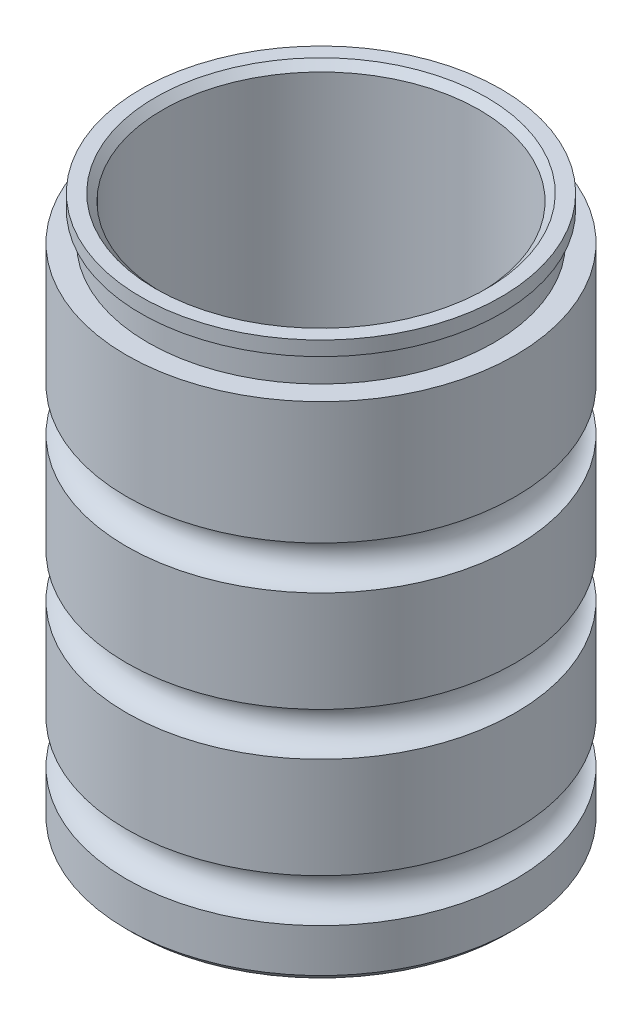
ISO-10303-21;
HEADER;
FILE_DESCRIPTION(('STEP AP214'),'2;1');
FILE_NAME('part.step','',(''),(''),'','','');
FILE_SCHEMA(('AUTOMOTIVE_DESIGN { 1 0 10303 214 1 1 1 1 }'));
ENDSEC;
DATA;
#1=APPLICATION_CONTEXT('core data for automotive mechanical design processes');
#2=APPLICATION_PROTOCOL_DEFINITION('international standard','automotive_design',2000,#1);
#3=PRODUCT_CONTEXT('',#1,'mechanical');
#4=PRODUCT('Part','Part','',(#3));
#5=PRODUCT_RELATED_PRODUCT_CATEGORY('part','',(#4));
#6=PRODUCT_DEFINITION_FORMATION('','',#4);
#7=PRODUCT_DEFINITION_CONTEXT('part definition',#1,'design');
#8=PRODUCT_DEFINITION('design','',#6,#7);
#9=PRODUCT_DEFINITION_SHAPE('','',#8);
#10=(LENGTH_UNIT() NAMED_UNIT(*) SI_UNIT(.MILLI.,.METRE.));
#11=(NAMED_UNIT(*) PLANE_ANGLE_UNIT() SI_UNIT($,.RADIAN.));
#12=(NAMED_UNIT(*) SI_UNIT($,.STERADIAN.) SOLID_ANGLE_UNIT());
#13=UNCERTAINTY_MEASURE_WITH_UNIT(LENGTH_MEASURE(1.E-05),#10,'distance_accuracy_value','');
#14=(GEOMETRIC_REPRESENTATION_CONTEXT(3) GLOBAL_UNCERTAINTY_ASSIGNED_CONTEXT((#13)) GLOBAL_UNIT_ASSIGNED_CONTEXT((#10,
#11,#12)) REPRESENTATION_CONTEXT('',''));
#15=CARTESIAN_POINT('',(0.,0.,0.));
#16=DIRECTION('',(0.,0.,1.));
#17=DIRECTION('',(1.,0.,0.));
#18=AXIS2_PLACEMENT_3D('',#15,#16,#17);
#19=CARTESIAN_POINT('',(0.,-29.1154086371947,0.));
#20=DIRECTION('',(0.,-1.,0.));
#21=DIRECTION('',(0.,0.,-1.));
#22=AXIS2_PLACEMENT_3D('',#19,#20,#21);
#23=CYLINDRICAL_SURFACE('',#22,11.);
#24=CARTESIAN_POINT('',(0.,37.5,0.));
#25=DIRECTION('',(0.,-1.,0.));
#26=DIRECTION('',(0.,0.,-1.));
#27=AXIS2_PLACEMENT_3D('',#24,#25,#26);
#28=CIRCLE('',#27,11.);
#29=CARTESIAN_POINT('',(0.,37.5,-11.));
#30=VERTEX_POINT('',#29);
#31=EDGE_CURVE('E49',#30,#30,#28,.F.);
#32=ORIENTED_EDGE('',*,*,#31,.T.);
#33=EDGE_LOOP('',(#32));
#34=FACE_BOUND('',#33,.T.);
#35=CARTESIAN_POINT('',(0.,12.,0.));
#36=DIRECTION('',(0.,-1.,0.));
#37=DIRECTION('',(0.,0.,-1.));
#38=AXIS2_PLACEMENT_3D('',#35,#36,#37);
#39=CIRCLE('',#38,11.);
#40=CARTESIAN_POINT('',(0.,12.,-11.));
#41=VERTEX_POINT('',#40);
#42=EDGE_CURVE('E82',#41,#41,#39,.T.);
#43=ORIENTED_EDGE('',*,*,#42,.T.);
#44=EDGE_LOOP('',(#43));
#45=FACE_BOUND('',#44,.T.);
#46=ADVANCED_FACE('F37',(#34,#45),#23,.F.);
#47=CARTESIAN_POINT('',(-11.,12.,0.));
#48=DIRECTION('',(0.,-1.,0.));
#49=DIRECTION('',(0.,0.,-1.));
#50=AXIS2_PLACEMENT_3D('',#47,#48,#49);
#51=PLANE('',#50);
#52=CARTESIAN_POINT('',(0.,12.,0.));
#53=DIRECTION('',(0.,-1.,0.));
#54=DIRECTION('',(0.,0.,-1.));
#55=AXIS2_PLACEMENT_3D('',#52,#53,#54);
#56=CIRCLE('',#55,2.5);
#57=CARTESIAN_POINT('',(0.,12.,-2.5));
#58=VERTEX_POINT('',#57);
#59=EDGE_CURVE('E79',#58,#58,#56,.T.);
#60=ORIENTED_EDGE('',*,*,#59,.T.);
#61=EDGE_LOOP('',(#60));
#62=FACE_BOUND('',#61,.T.);
#63=ORIENTED_EDGE('',*,*,#42,.F.);
#64=EDGE_LOOP('',(#63));
#65=FACE_BOUND('',#64,.T.);
#66=ADVANCED_FACE('F143',(#62,#65),#51,.F.);
#67=CARTESIAN_POINT('',(0.,0.,0.));
#68=DIRECTION('',(0.,1.,0.));
#69=DIRECTION('',(0.,0.,1.));
#70=AXIS2_PLACEMENT_3D('',#67,#68,#69);
#71=PLANE('',#70);
#72=CARTESIAN_POINT('',(0.,0.,0.));
#73=DIRECTION('',(0.,1.,0.));
#74=DIRECTION('',(0.,0.,1.));
#75=AXIS2_PLACEMENT_3D('',#72,#73,#74);
#76=CIRCLE('',#75,13.);
#77=CARTESIAN_POINT('',(0.,0.,13.));
#78=VERTEX_POINT('',#77);
#79=EDGE_CURVE('E45',#78,#78,#76,.F.);
#80=ORIENTED_EDGE('',*,*,#79,.T.);
#81=EDGE_LOOP('',(#80));
#82=FACE_BOUND('',#81,.T.);
#83=CARTESIAN_POINT('',(-8.,0.,0.));
#84=DIRECTION('',(0.,1.,0.));
#85=DIRECTION('',(0.,0.,1.));
#86=AXIS2_PLACEMENT_3D('',#83,#84,#85);
#87=CIRCLE('',#86,3.00000000000001);
#88=CARTESIAN_POINT('',(-8.,0.,3.00000000000001));
#89=VERTEX_POINT('',#88);
#90=EDGE_CURVE('E61',#89,#89,#87,.T.);
#91=ORIENTED_EDGE('',*,*,#90,.T.);
#92=EDGE_LOOP('',(#91));
#93=FACE_BOUND('',#92,.T.);
#94=CARTESIAN_POINT('',(8.,0.,0.));
#95=DIRECTION('',(0.,1.,0.));
#96=DIRECTION('',(0.,0.,1.));
#97=AXIS2_PLACEMENT_3D('',#94,#95,#96);
#98=CIRCLE('',#97,3.00000000000001);
#99=CARTESIAN_POINT('',(8.,0.,3.00000000000001));
#100=VERTEX_POINT('',#99);
#101=EDGE_CURVE('E64',#100,#100,#98,.T.);
#102=ORIENTED_EDGE('',*,*,#101,.T.);
#103=EDGE_LOOP('',(#102));
#104=FACE_BOUND('',#103,.T.);
#105=CARTESIAN_POINT('',(0.,0.,0.));
#106=DIRECTION('',(0.,1.,0.));
#107=DIRECTION('',(0.,0.,1.));
#108=AXIS2_PLACEMENT_3D('',#105,#106,#107);
#109=CIRCLE('',#108,2.50000000000001);
#110=CARTESIAN_POINT('',(0.,0.,2.50000000000001));
#111=VERTEX_POINT('',#110);
#112=EDGE_CURVE('E70',#111,#111,#109,.T.);
#113=ORIENTED_EDGE('',*,*,#112,.T.);
#114=EDGE_LOOP('',(#113));
#115=FACE_BOUND('',#114,.T.);
#116=ADVANCED_FACE('F149',(#82,#93,#104,#115),#71,.F.);
#117=CARTESIAN_POINT('',(0.,-29.1154086371947,0.));
#118=DIRECTION('',(0.,-1.,0.));
#119=DIRECTION('',(0.,0.,-1.));
#120=AXIS2_PLACEMENT_3D('',#117,#118,#119);
#121=CYLINDRICAL_SURFACE('',#120,13.5);
#122=CARTESIAN_POINT('',(0.,0.500000000000004,0.));
#123=DIRECTION('',(0.,1.,0.));
#124=DIRECTION('',(0.,0.,1.));
#125=AXIS2_PLACEMENT_3D('',#122,#123,#124);
#126=CIRCLE('',#125,13.5);
#127=CARTESIAN_POINT('',(0.,0.500000000000004,13.5));
#128=VERTEX_POINT('',#127);
#129=EDGE_CURVE('E10',#128,#128,#126,.T.);
#130=ORIENTED_EDGE('',*,*,#129,.T.);
#131=EDGE_LOOP('',(#130));
#132=FACE_BOUND('',#131,.T.);
#133=CARTESIAN_POINT('',(0.,3.5,0.));
#134=DIRECTION('',(0.,-1.,0.));
#135=DIRECTION('',(0.,0.,-1.));
#136=AXIS2_PLACEMENT_3D('',#133,#134,#135);
#137=CIRCLE('',#136,13.5);
#138=CARTESIAN_POINT('',(0.,3.5,-13.5));
#139=VERTEX_POINT('',#138);
#140=EDGE_CURVE('E85',#139,#139,#137,.T.);
#141=ORIENTED_EDGE('',*,*,#140,.T.);
#142=EDGE_LOOP('',(#141));
#143=FACE_BOUND('',#142,.T.);
#144=ADVANCED_FACE('F245',(#132,#143),#121,.T.);
#145=CARTESIAN_POINT('',(0.,5.,0.));
#146=DIRECTION('',(0.,-1.,0.));
#147=DIRECTION('',(0.,0.,-1.));
#148=AXIS2_PLACEMENT_3D('',#145,#146,#147);
#149=TOROIDAL_SURFACE('',#148,13.5,1.5);
#150=ORIENTED_EDGE('',*,*,#140,.F.);
#151=EDGE_LOOP('',(#150));
#152=FACE_BOUND('',#151,.T.);
#153=CARTESIAN_POINT('',(0.,6.5,0.));
#154=DIRECTION('',(0.,-1.,0.));
#155=DIRECTION('',(0.,0.,-1.));
#156=AXIS2_PLACEMENT_3D('',#153,#154,#155);
#157=CIRCLE('',#156,13.5);
#158=CARTESIAN_POINT('',(0.,6.5,-13.5));
#159=VERTEX_POINT('',#158);
#160=EDGE_CURVE('E88',#159,#159,#157,.T.);
#161=ORIENTED_EDGE('',*,*,#160,.T.);
#162=EDGE_LOOP('',(#161));
#163=FACE_BOUND('',#162,.T.);
#164=ADVANCED_FACE('F241',(#152,#163),#149,.F.);
#165=CARTESIAN_POINT('',(0.,-29.1154086371947,0.));
#166=DIRECTION('',(0.,-1.,0.));
#167=DIRECTION('',(0.,0.,-1.));
#168=AXIS2_PLACEMENT_3D('',#165,#166,#167);
#169=CYLINDRICAL_SURFACE('',#168,13.5);
#170=ORIENTED_EDGE('',*,*,#160,.F.);
#171=EDGE_LOOP('',(#170));
#172=FACE_BOUND('',#171,.T.);
#173=CARTESIAN_POINT('',(0.,13.5,0.));
#174=DIRECTION('',(0.,-1.,0.));
#175=DIRECTION('',(0.,0.,-1.));
#176=AXIS2_PLACEMENT_3D('',#173,#174,#175);
#177=CIRCLE('',#176,13.5);
#178=CARTESIAN_POINT('',(0.,13.5,-13.5));
#179=VERTEX_POINT('',#178);
#180=EDGE_CURVE('E91',#179,#179,#177,.T.);
#181=ORIENTED_EDGE('',*,*,#180,.T.);
#182=EDGE_LOOP('',(#181));
#183=FACE_BOUND('',#182,.T.);
#184=ADVANCED_FACE('F237',(#172,#183),#169,.T.);
#185=CARTESIAN_POINT('',(0.,15.,0.));
#186=DIRECTION('',(0.,-1.,0.));
#187=DIRECTION('',(0.,0.,-1.));
#188=AXIS2_PLACEMENT_3D('',#185,#186,#187);
#189=TOROIDAL_SURFACE('',#188,13.5,1.5);
#190=ORIENTED_EDGE('',*,*,#180,.F.);
#191=EDGE_LOOP('',(#190));
#192=FACE_BOUND('',#191,.T.);
#193=CARTESIAN_POINT('',(0.,16.5,0.));
#194=DIRECTION('',(0.,-1.,0.));
#195=DIRECTION('',(0.,0.,-1.));
#196=AXIS2_PLACEMENT_3D('',#193,#194,#195);
#197=CIRCLE('',#196,13.5);
#198=CARTESIAN_POINT('',(0.,16.5,-13.5));
#199=VERTEX_POINT('',#198);
#200=EDGE_CURVE('E94',#199,#199,#197,.T.);
#201=ORIENTED_EDGE('',*,*,#200,.T.);
#202=EDGE_LOOP('',(#201));
#203=FACE_BOUND('',#202,.T.);
#204=ADVANCED_FACE('F233',(#192,#203),#189,.F.);
#205=CARTESIAN_POINT('',(0.,-29.1154086371947,0.));
#206=DIRECTION('',(0.,-1.,0.));
#207=DIRECTION('',(0.,0.,-1.));
#208=AXIS2_PLACEMENT_3D('',#205,#206,#207);
#209=CYLINDRICAL_SURFACE('',#208,13.5);
#210=ORIENTED_EDGE('',*,*,#200,.F.);
#211=EDGE_LOOP('',(#210));
#212=FACE_BOUND('',#211,.T.);
#213=CARTESIAN_POINT('',(0.,23.5,0.));
#214=DIRECTION('',(0.,-1.,0.));
#215=DIRECTION('',(0.,0.,-1.));
#216=AXIS2_PLACEMENT_3D('',#213,#214,#215);
#217=CIRCLE('',#216,13.5);
#218=CARTESIAN_POINT('',(0.,23.5,-13.5));
#219=VERTEX_POINT('',#218);
#220=EDGE_CURVE('E97',#219,#219,#217,.T.);
#221=ORIENTED_EDGE('',*,*,#220,.T.);
#222=EDGE_LOOP('',(#221));
#223=FACE_BOUND('',#222,.T.);
#224=ADVANCED_FACE('F229',(#212,#223),#209,.T.);
#225=CARTESIAN_POINT('',(0.,25.,0.));
#226=DIRECTION('',(0.,-1.,0.));
#227=DIRECTION('',(0.,0.,-1.));
#228=AXIS2_PLACEMENT_3D('',#225,#226,#227);
#229=TOROIDAL_SURFACE('',#228,13.5,1.5);
#230=ORIENTED_EDGE('',*,*,#220,.F.);
#231=EDGE_LOOP('',(#230));
#232=FACE_BOUND('',#231,.T.);
#233=CARTESIAN_POINT('',(0.,26.5,0.));
#234=DIRECTION('',(0.,-1.,0.));
#235=DIRECTION('',(0.,0.,-1.));
#236=AXIS2_PLACEMENT_3D('',#233,#234,#235);
#237=CIRCLE('',#236,13.5);
#238=CARTESIAN_POINT('',(0.,26.5,-13.5));
#239=VERTEX_POINT('',#238);
#240=EDGE_CURVE('E100',#239,#239,#237,.T.);
#241=ORIENTED_EDGE('',*,*,#240,.T.);
#242=EDGE_LOOP('',(#241));
#243=FACE_BOUND('',#242,.T.);
#244=ADVANCED_FACE('F225',(#232,#243),#229,.F.);
#245=CARTESIAN_POINT('',(0.,-29.1154086371947,0.));
#246=DIRECTION('',(0.,-1.,0.));
#247=DIRECTION('',(0.,0.,-1.));
#248=AXIS2_PLACEMENT_3D('',#245,#246,#247);
#249=CYLINDRICAL_SURFACE('',#248,13.5);
#250=ORIENTED_EDGE('',*,*,#240,.F.);
#251=EDGE_LOOP('',(#250));
#252=FACE_BOUND('',#251,.T.);
#253=CARTESIAN_POINT('',(0.,35.,0.));
#254=DIRECTION('',(0.,-1.,0.));
#255=DIRECTION('',(0.,0.,-1.));
#256=AXIS2_PLACEMENT_3D('',#253,#254,#255);
#257=CIRCLE('',#256,13.5);
#258=CARTESIAN_POINT('',(0.,35.,-13.5));
#259=VERTEX_POINT('',#258);
#260=EDGE_CURVE('E103',#259,#259,#257,.T.);
#261=ORIENTED_EDGE('',*,*,#260,.T.);
#262=EDGE_LOOP('',(#261));
#263=FACE_BOUND('',#262,.T.);
#264=ADVANCED_FACE('F221',(#252,#263),#249,.T.);
#265=CARTESIAN_POINT('',(-12.,35.,0.));
#266=DIRECTION('',(0.,-1.,0.));
#267=DIRECTION('',(0.,0.,-1.));
#268=AXIS2_PLACEMENT_3D('',#265,#266,#267);
#269=PLANE('',#268);
#270=ORIENTED_EDGE('',*,*,#260,.F.);
#271=EDGE_LOOP('',(#270));
#272=FACE_BOUND('',#271,.T.);
#273=CARTESIAN_POINT('',(0.,35.,0.));
#274=DIRECTION('',(0.,-1.,0.));
#275=DIRECTION('',(0.,0.,-1.));
#276=AXIS2_PLACEMENT_3D('',#273,#274,#275);
#277=CIRCLE('',#276,12.);
#278=CARTESIAN_POINT('',(0.,35.,-12.));
#279=VERTEX_POINT('',#278);
#280=EDGE_CURVE('E106',#279,#279,#277,.T.);
#281=ORIENTED_EDGE('',*,*,#280,.T.);
#282=EDGE_LOOP('',(#281));
#283=FACE_BOUND('',#282,.T.);
#284=ADVANCED_FACE('F217',(#272,#283),#269,.F.);
#285=CARTESIAN_POINT('',(0.,-29.1154086371947,0.));
#286=DIRECTION('',(0.,-1.,0.));
#287=DIRECTION('',(0.,0.,-1.));
#288=AXIS2_PLACEMENT_3D('',#285,#286,#287);
#289=CYLINDRICAL_SURFACE('',#288,12.);
#290=ORIENTED_EDGE('',*,*,#280,.F.);
#291=EDGE_LOOP('',(#290));
#292=FACE_BOUND('',#291,.T.);
#293=CARTESIAN_POINT('',(0.,37.,0.));
#294=DIRECTION('',(0.,-1.,0.));
#295=DIRECTION('',(0.,0.,-1.));
#296=AXIS2_PLACEMENT_3D('',#293,#294,#295);
#297=CIRCLE('',#296,12.);
#298=CARTESIAN_POINT('',(0.,37.,-12.));
#299=VERTEX_POINT('',#298);
#300=EDGE_CURVE('E109',#299,#299,#297,.T.);
#301=ORIENTED_EDGE('',*,*,#300,.T.);
#302=EDGE_LOOP('',(#301));
#303=FACE_BOUND('',#302,.T.);
#304=ADVANCED_FACE('F210',(#292,#303),#289,.T.);
#305=CARTESIAN_POINT('',(-12.5,37.,0.));
#306=DIRECTION('',(0.,1.,0.));
#307=DIRECTION('',(0.,0.,1.));
#308=AXIS2_PLACEMENT_3D('',#305,#306,#307);
#309=PLANE('',#308);
#310=ORIENTED_EDGE('',*,*,#300,.F.);
#311=EDGE_LOOP('',(#310));
#312=FACE_BOUND('',#311,.T.);
#313=CARTESIAN_POINT('',(0.,37.,0.));
#314=DIRECTION('',(0.,-1.,0.));
#315=DIRECTION('',(0.,0.,-1.));
#316=AXIS2_PLACEMENT_3D('',#313,#314,#315);
#317=CIRCLE('',#316,12.5);
#318=CARTESIAN_POINT('',(0.,37.,-12.5));
#319=VERTEX_POINT('',#318);
#320=EDGE_CURVE('E112',#319,#319,#317,.T.);
#321=ORIENTED_EDGE('',*,*,#320,.T.);
#322=EDGE_LOOP('',(#321));
#323=FACE_BOUND('',#322,.T.);
#324=ADVANCED_FACE('F204',(#312,#323),#309,.F.);
#325=CARTESIAN_POINT('',(0.,-29.1154086371947,0.));
#326=DIRECTION('',(0.,-1.,0.));
#327=DIRECTION('',(0.,0.,-1.));
#328=AXIS2_PLACEMENT_3D('',#325,#326,#327);
#329=CYLINDRICAL_SURFACE('',#328,12.5);
#330=ORIENTED_EDGE('',*,*,#320,.F.);
#331=EDGE_LOOP('',(#330));
#332=FACE_BOUND('',#331,.T.);
#333=CARTESIAN_POINT('',(0.,38.,0.));
#334=DIRECTION('',(0.,-1.,0.));
#335=DIRECTION('',(0.,0.,-1.));
#336=AXIS2_PLACEMENT_3D('',#333,#334,#335);
#337=CIRCLE('',#336,12.5);
#338=CARTESIAN_POINT('',(0.,38.,-12.5));
#339=VERTEX_POINT('',#338);
#340=EDGE_CURVE('E115',#339,#339,#337,.T.);
#341=ORIENTED_EDGE('',*,*,#340,.T.);
#342=EDGE_LOOP('',(#341));
#343=FACE_BOUND('',#342,.T.);
#344=ADVANCED_FACE('F199',(#332,#343),#329,.T.);
#345=CARTESIAN_POINT('',(-12.5,38.,0.));
#346=DIRECTION('',(0.,-1.,0.));
#347=DIRECTION('',(0.,0.,-1.));
#348=AXIS2_PLACEMENT_3D('',#345,#346,#347);
#349=PLANE('',#348);
#350=CARTESIAN_POINT('',(0.,38.,0.));
#351=DIRECTION('',(0.,-1.,0.));
#352=DIRECTION('',(0.,0.,-1.));
#353=AXIS2_PLACEMENT_3D('',#350,#351,#352);
#354=CIRCLE('',#353,11.5);
#355=CARTESIAN_POINT('',(0.,38.,-11.5));
#356=VERTEX_POINT('',#355);
#357=EDGE_CURVE('E53',#356,#356,#354,.T.);
#358=ORIENTED_EDGE('',*,*,#357,.T.);
#359=EDGE_LOOP('',(#358));
#360=FACE_BOUND('',#359,.T.);
#361=ORIENTED_EDGE('',*,*,#340,.F.);
#362=EDGE_LOOP('',(#361));
#363=FACE_BOUND('',#362,.T.);
#364=ADVANCED_FACE('F196',(#360,#363),#349,.F.);
#365=CARTESIAN_POINT('',(-8.,10.,0.));
#366=DIRECTION('',(0.,-1.,0.));
#367=DIRECTION('',(0.,0.,-1.));
#368=AXIS2_PLACEMENT_3D('',#365,#366,#367);
#369=CYLINDRICAL_SURFACE('',#368,2.5);
#370=CARTESIAN_POINT('',(-8.,0.500000000000011,0.));
#371=DIRECTION('',(0.,1.,0.));
#372=DIRECTION('',(0.,0.,1.));
#373=AXIS2_PLACEMENT_3D('',#370,#371,#372);
#374=CIRCLE('',#373,2.5);
#375=CARTESIAN_POINT('',(-8.,0.500000000000011,2.5));
#376=VERTEX_POINT('',#375);
#377=EDGE_CURVE('E67',#376,#376,#374,.F.);
#378=ORIENTED_EDGE('',*,*,#377,.T.);
#379=EDGE_LOOP('',(#378));
#380=FACE_BOUND('',#379,.T.);
#381=CARTESIAN_POINT('',(-8.,10.,0.));
#382=DIRECTION('',(0.,-1.,0.));
#383=DIRECTION('',(0.,0.,-1.));
#384=AXIS2_PLACEMENT_3D('',#381,#382,#383);
#385=CIRCLE('',#384,2.5);
#386=CARTESIAN_POINT('',(-8.,10.,-2.5));
#387=VERTEX_POINT('',#386);
#388=EDGE_CURVE('E119',#387,#387,#385,.T.);
#389=ORIENTED_EDGE('',*,*,#388,.F.);
#390=EDGE_LOOP('',(#389));
#391=FACE_BOUND('',#390,.T.);
#392=ADVANCED_FACE('F138',(#380,#391),#369,.F.);
#393=CARTESIAN_POINT('',(-8.,10.,0.));
#394=DIRECTION('',(0.,-1.,0.));
#395=DIRECTION('',(0.,0.,-1.));
#396=AXIS2_PLACEMENT_3D('',#393,#394,#395);
#397=PLANE('',#396);
#398=ORIENTED_EDGE('',*,*,#388,.T.);
#399=EDGE_LOOP('',(#398));
#400=FACE_BOUND('',#399,.T.);
#401=ADVANCED_FACE('F129',(#400),#397,.T.);
#402=CARTESIAN_POINT('',(8.,10.,0.));
#403=DIRECTION('',(0.,-1.,0.));
#404=DIRECTION('',(0.,0.,-1.));
#405=AXIS2_PLACEMENT_3D('',#402,#403,#404);
#406=CYLINDRICAL_SURFACE('',#405,2.5);
#407=CARTESIAN_POINT('',(8.,0.500000000000011,0.));
#408=DIRECTION('',(0.,1.,0.));
#409=DIRECTION('',(0.,0.,1.));
#410=AXIS2_PLACEMENT_3D('',#407,#408,#409);
#411=CIRCLE('',#410,2.5);
#412=CARTESIAN_POINT('',(8.,0.500000000000011,2.5));
#413=VERTEX_POINT('',#412);
#414=EDGE_CURVE('E58',#413,#413,#411,.F.);
#415=ORIENTED_EDGE('',*,*,#414,.T.);
#416=EDGE_LOOP('',(#415));
#417=FACE_BOUND('',#416,.T.);
#418=CARTESIAN_POINT('',(8.,10.,0.));
#419=DIRECTION('',(0.,-1.,0.));
#420=DIRECTION('',(0.,0.,-1.));
#421=AXIS2_PLACEMENT_3D('',#418,#419,#420);
#422=CIRCLE('',#421,2.5);
#423=CARTESIAN_POINT('',(8.,10.,-2.5));
#424=VERTEX_POINT('',#423);
#425=EDGE_CURVE('E118',#424,#424,#422,.T.);
#426=ORIENTED_EDGE('',*,*,#425,.F.);
#427=EDGE_LOOP('',(#426));
#428=FACE_BOUND('',#427,.T.);
#429=ADVANCED_FACE('F127',(#417,#428),#406,.F.);
#430=CARTESIAN_POINT('',(8.,10.,0.));
#431=DIRECTION('',(0.,-1.,0.));
#432=DIRECTION('',(0.,0.,-1.));
#433=AXIS2_PLACEMENT_3D('',#430,#431,#432);
#434=PLANE('',#433);
#435=ORIENTED_EDGE('',*,*,#425,.T.);
#436=EDGE_LOOP('',(#435));
#437=FACE_BOUND('',#436,.T.);
#438=ADVANCED_FACE('F125',(#437),#434,.T.);
#439=CARTESIAN_POINT('',(0.,38.,0.));
#440=DIRECTION('',(0.,-1.,0.));
#441=DIRECTION('',(0.,0.,-1.));
#442=AXIS2_PLACEMENT_3D('',#439,#440,#441);
#443=CYLINDRICAL_SURFACE('',#442,2.);
#444=CARTESIAN_POINT('',(0.,11.5,0.));
#445=DIRECTION('',(0.,-1.,0.));
#446=DIRECTION('',(0.,0.,-1.));
#447=AXIS2_PLACEMENT_3D('',#444,#445,#446);
#448=CIRCLE('',#447,2.);
#449=CARTESIAN_POINT('',(0.,11.5,-2.));
#450=VERTEX_POINT('',#449);
#451=EDGE_CURVE('E73',#450,#450,#448,.F.);
#452=ORIENTED_EDGE('',*,*,#451,.T.);
#453=EDGE_LOOP('',(#452));
#454=FACE_BOUND('',#453,.T.);
#455=CARTESIAN_POINT('',(0.,0.500000000000007,0.));
#456=DIRECTION('',(0.,1.,0.));
#457=DIRECTION('',(0.,0.,1.));
#458=AXIS2_PLACEMENT_3D('',#455,#456,#457);
#459=CIRCLE('',#458,2.);
#460=CARTESIAN_POINT('',(0.,0.500000000000007,2.));
#461=VERTEX_POINT('',#460);
#462=EDGE_CURVE('E76',#461,#461,#459,.F.);
#463=ORIENTED_EDGE('',*,*,#462,.T.);
#464=EDGE_LOOP('',(#463));
#465=FACE_BOUND('',#464,.T.);
#466=ADVANCED_FACE('F136',(#454,#465),#443,.F.);
#467=CARTESIAN_POINT('',(0.,12.,0.));
#468=DIRECTION('',(0.,1.,0.));
#469=DIRECTION('',(0.,0.,1.));
#470=AXIS2_PLACEMENT_3D('',#467,#468,#469);
#471=CONICAL_SURFACE('',#470,2.5,0.78539816339745);
#472=ORIENTED_EDGE('',*,*,#451,.F.);
#473=EDGE_LOOP('',(#472));
#474=FACE_BOUND('',#473,.T.);
#475=ORIENTED_EDGE('',*,*,#59,.F.);
#476=EDGE_LOOP('',(#475));
#477=FACE_BOUND('',#476,.T.);
#478=ADVANCED_FACE('F156',(#474,#477),#471,.F.);
#479=CARTESIAN_POINT('',(0.,0.500000000000007,0.));
#480=DIRECTION('',(0.,-1.,0.));
#481=DIRECTION('',(0.,0.,-1.));
#482=AXIS2_PLACEMENT_3D('',#479,#480,#481);
#483=CONICAL_SURFACE('',#482,2.,0.78539816339745);
#484=ORIENTED_EDGE('',*,*,#112,.F.);
#485=EDGE_LOOP('',(#484));
#486=FACE_BOUND('',#485,.T.);
#487=ORIENTED_EDGE('',*,*,#462,.F.);
#488=EDGE_LOOP('',(#487));
#489=FACE_BOUND('',#488,.T.);
#490=ADVANCED_FACE('F162',(#486,#489),#483,.F.);
#491=CARTESIAN_POINT('',(-8.,0.500000000000011,0.));
#492=DIRECTION('',(0.,-1.,0.));
#493=DIRECTION('',(0.,0.,-1.));
#494=AXIS2_PLACEMENT_3D('',#491,#492,#493);
#495=CONICAL_SURFACE('',#494,2.5,0.785398163397447);
#496=ORIENTED_EDGE('',*,*,#90,.F.);
#497=EDGE_LOOP('',(#496));
#498=FACE_BOUND('',#497,.T.);
#499=ORIENTED_EDGE('',*,*,#377,.F.);
#500=EDGE_LOOP('',(#499));
#501=FACE_BOUND('',#500,.T.);
#502=ADVANCED_FACE('F169',(#498,#501),#495,.F.);
#503=CARTESIAN_POINT('',(8.,0.500000000000011,0.));
#504=DIRECTION('',(0.,-1.,0.));
#505=DIRECTION('',(0.,0.,-1.));
#506=AXIS2_PLACEMENT_3D('',#503,#504,#505);
#507=CONICAL_SURFACE('',#506,2.5,0.785398163397447);
#508=ORIENTED_EDGE('',*,*,#101,.F.);
#509=EDGE_LOOP('',(#508));
#510=FACE_BOUND('',#509,.T.);
#511=ORIENTED_EDGE('',*,*,#414,.F.);
#512=EDGE_LOOP('',(#511));
#513=FACE_BOUND('',#512,.T.);
#514=ADVANCED_FACE('F176',(#510,#513),#507,.F.);
#515=CARTESIAN_POINT('',(0.,38.,0.));
#516=DIRECTION('',(0.,1.,0.));
#517=DIRECTION('',(0.,0.,1.));
#518=AXIS2_PLACEMENT_3D('',#515,#516,#517);
#519=CONICAL_SURFACE('',#518,11.5,0.785398163397452);
#520=ORIENTED_EDGE('',*,*,#31,.F.);
#521=EDGE_LOOP('',(#520));
#522=FACE_BOUND('',#521,.T.);
#523=ORIENTED_EDGE('',*,*,#357,.F.);
#524=EDGE_LOOP('',(#523));
#525=FACE_BOUND('',#524,.T.);
#526=ADVANCED_FACE('F182',(#522,#525),#519,.F.);
#527=CARTESIAN_POINT('',(0.,0.,0.));
#528=DIRECTION('',(0.,1.,0.));
#529=DIRECTION('',(0.,0.,1.));
#530=AXIS2_PLACEMENT_3D('',#527,#528,#529);
#531=CONICAL_SURFACE('',#530,13.,0.785398163397445);
#532=ORIENTED_EDGE('',*,*,#129,.F.);
#533=EDGE_LOOP('',(#532));
#534=FACE_BOUND('',#533,.T.);
#535=ORIENTED_EDGE('',*,*,#79,.F.);
#536=EDGE_LOOP('',(#535));
#537=FACE_BOUND('',#536,.T.);
#538=ADVANCED_FACE('F40',(#534,#537),#531,.T.);
#539=CLOSED_SHELL('',(#46,#66,#116,#144,#164,#184,#204,#224,#244,#264,#284,#304,#324,#344,#364,
#392,#401,#429,#438,#466,#478,#490,#502,#514,#526,#538));
#540=MANIFOLD_SOLID_BREP('B2',#539);
#541=ADVANCED_BREP_SHAPE_REPRESENTATION('',(#18,#540),#14);
#542=SHAPE_DEFINITION_REPRESENTATION(#9,#541);
ENDSEC;
END-ISO-10303-21;
